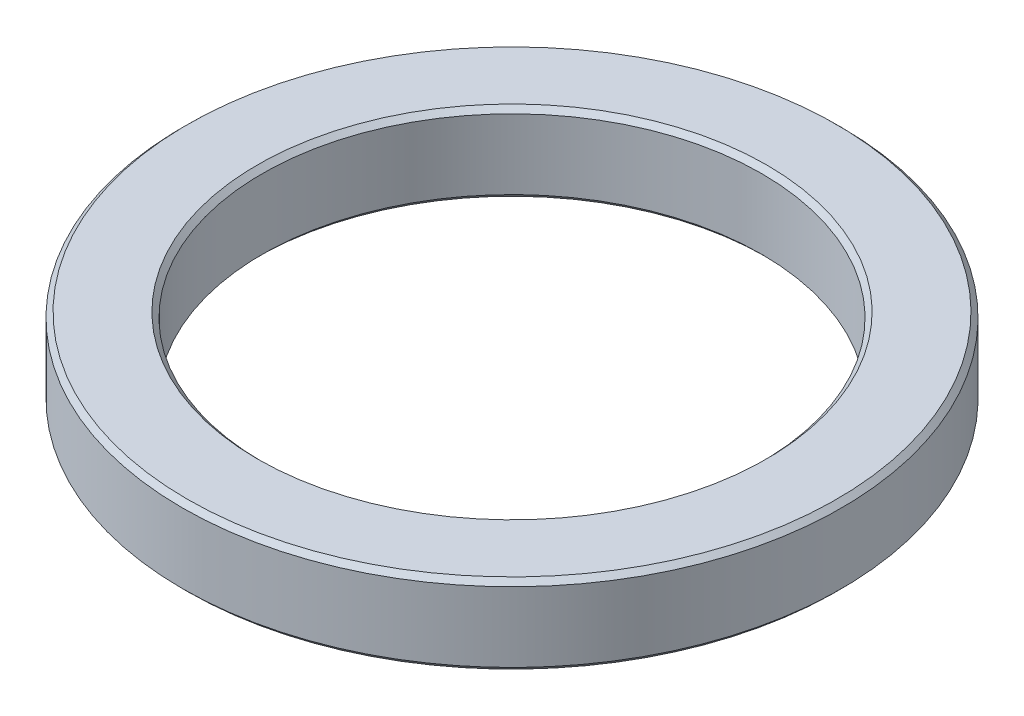
ISO-10303-21;
HEADER;
FILE_DESCRIPTION(('STEP AP214'),'2;1');
FILE_NAME('part.step','',(''),(''),'','','');
FILE_SCHEMA(('AUTOMOTIVE_DESIGN { 1 0 10303 214 1 1 1 1 }'));
ENDSEC;
DATA;
#1=APPLICATION_CONTEXT('core data for automotive mechanical design processes');
#2=APPLICATION_PROTOCOL_DEFINITION('international standard','automotive_design',2000,#1);
#3=PRODUCT_CONTEXT('',#1,'mechanical');
#4=PRODUCT('Part','Part','',(#3));
#5=PRODUCT_RELATED_PRODUCT_CATEGORY('part','',(#4));
#6=PRODUCT_DEFINITION_FORMATION('','',#4);
#7=PRODUCT_DEFINITION_CONTEXT('part definition',#1,'design');
#8=PRODUCT_DEFINITION('design','',#6,#7);
#9=PRODUCT_DEFINITION_SHAPE('','',#8);
#10=(LENGTH_UNIT() NAMED_UNIT(*) SI_UNIT(.MILLI.,.METRE.));
#11=(NAMED_UNIT(*) PLANE_ANGLE_UNIT() SI_UNIT($,.RADIAN.));
#12=(NAMED_UNIT(*) SI_UNIT($,.STERADIAN.) SOLID_ANGLE_UNIT());
#13=UNCERTAINTY_MEASURE_WITH_UNIT(LENGTH_MEASURE(1.E-05),#10,'distance_accuracy_value','');
#14=(GEOMETRIC_REPRESENTATION_CONTEXT(3) GLOBAL_UNCERTAINTY_ASSIGNED_CONTEXT((#13)) GLOBAL_UNIT_ASSIGNED_CONTEXT((#10,
#11,#12)) REPRESENTATION_CONTEXT('',''));
#15=CARTESIAN_POINT('',(0.,0.,0.));
#16=DIRECTION('',(0.,0.,1.));
#17=DIRECTION('',(1.,0.,0.));
#18=AXIS2_PLACEMENT_3D('',#15,#16,#17);
#19=CARTESIAN_POINT('',(0.,4.,0.));
#20=DIRECTION('',(0.,1.,0.));
#21=DIRECTION('',(0.,0.,1.));
#22=AXIS2_PLACEMENT_3D('',#19,#20,#21);
#23=PLANE('',#22);
#24=CARTESIAN_POINT('',(0.,4.,0.));
#25=DIRECTION('',(0.,1.,0.));
#26=DIRECTION('',(0.,0.,1.));
#27=AXIS2_PLACEMENT_3D('',#24,#25,#26);
#28=CIRCLE('',#27,25.5);
#29=CARTESIAN_POINT('',(0.,4.,25.5));
#30=VERTEX_POINT('',#29);
#31=EDGE_CURVE('E10',#30,#30,#28,.F.);
#32=ORIENTED_EDGE('',*,*,#31,.T.);
#33=EDGE_LOOP('',(#32));
#34=FACE_BOUND('',#33,.T.);
#35=CARTESIAN_POINT('',(0.,4.,0.));
#36=DIRECTION('',(0.,1.,0.));
#37=DIRECTION('',(0.,0.,1.));
#38=AXIS2_PLACEMENT_3D('',#35,#36,#37);
#39=CIRCLE('',#38,32.5);
#40=CARTESIAN_POINT('',(0.,4.,32.5));
#41=VERTEX_POINT('',#40);
#42=EDGE_CURVE('E43',#41,#41,#39,.T.);
#43=ORIENTED_EDGE('',*,*,#42,.T.);
#44=EDGE_LOOP('',(#43));
#45=FACE_BOUND('',#44,.T.);
#46=ADVANCED_FACE('F35',(#34,#45),#23,.T.);
#47=CARTESIAN_POINT('',(0.,-4.,0.));
#48=DIRECTION('',(0.,1.,0.));
#49=DIRECTION('',(0.,0.,1.));
#50=AXIS2_PLACEMENT_3D('',#47,#48,#49);
#51=PLANE('',#50);
#52=CARTESIAN_POINT('',(0.,-4.,0.));
#53=DIRECTION('',(0.,1.,0.));
#54=DIRECTION('',(0.,0.,1.));
#55=AXIS2_PLACEMENT_3D('',#52,#53,#54);
#56=CIRCLE('',#55,25.5);
#57=CARTESIAN_POINT('',(0.,-4.,25.5));
#58=VERTEX_POINT('',#57);
#59=EDGE_CURVE('E62',#58,#58,#56,.T.);
#60=ORIENTED_EDGE('',*,*,#59,.T.);
#61=EDGE_LOOP('',(#60));
#62=FACE_BOUND('',#61,.T.);
#63=CARTESIAN_POINT('',(0.,-4.,0.));
#64=DIRECTION('',(0.,1.,0.));
#65=DIRECTION('',(0.,0.,1.));
#66=AXIS2_PLACEMENT_3D('',#63,#64,#65);
#67=CIRCLE('',#66,32.5);
#68=CARTESIAN_POINT('',(0.,-4.,32.5));
#69=VERTEX_POINT('',#68);
#70=EDGE_CURVE('E65',#69,#69,#67,.F.);
#71=ORIENTED_EDGE('',*,*,#70,.T.);
#72=EDGE_LOOP('',(#71));
#73=FACE_BOUND('',#72,.T.);
#74=ADVANCED_FACE('F69',(#62,#73),#51,.F.);
#75=CARTESIAN_POINT('',(0.,4.,0.));
#76=DIRECTION('',(0.,-1.,0.));
#77=DIRECTION('',(0.,0.,-1.));
#78=AXIS2_PLACEMENT_3D('',#75,#76,#77);
#79=CYLINDRICAL_SURFACE('',#78,33.);
#80=CARTESIAN_POINT('',(0.,-3.5,0.));
#81=DIRECTION('',(0.,1.,0.));
#82=DIRECTION('',(0.,0.,1.));
#83=AXIS2_PLACEMENT_3D('',#80,#81,#82);
#84=CIRCLE('',#83,33.);
#85=CARTESIAN_POINT('',(0.,-3.5,33.));
#86=VERTEX_POINT('',#85);
#87=EDGE_CURVE('E47',#86,#86,#84,.T.);
#88=ORIENTED_EDGE('',*,*,#87,.T.);
#89=EDGE_LOOP('',(#88));
#90=FACE_BOUND('',#89,.T.);
#91=CARTESIAN_POINT('',(0.,3.5,0.));
#92=DIRECTION('',(0.,1.,0.));
#93=DIRECTION('',(0.,0.,1.));
#94=AXIS2_PLACEMENT_3D('',#91,#92,#93);
#95=CIRCLE('',#94,33.);
#96=CARTESIAN_POINT('',(0.,3.5,33.));
#97=VERTEX_POINT('',#96);
#98=EDGE_CURVE('E51',#97,#97,#95,.F.);
#99=ORIENTED_EDGE('',*,*,#98,.T.);
#100=EDGE_LOOP('',(#99));
#101=FACE_BOUND('',#100,.T.);
#102=ADVANCED_FACE('F79',(#90,#101),#79,.T.);
#103=CARTESIAN_POINT('',(0.,4.,0.));
#104=DIRECTION('',(0.,-1.,0.));
#105=DIRECTION('',(0.,0.,-1.));
#106=AXIS2_PLACEMENT_3D('',#103,#104,#105);
#107=CYLINDRICAL_SURFACE('',#106,25.);
#108=CARTESIAN_POINT('',(0.,-3.49999999999999,0.));
#109=DIRECTION('',(0.,1.,0.));
#110=DIRECTION('',(0.,0.,1.));
#111=AXIS2_PLACEMENT_3D('',#108,#109,#110);
#112=CIRCLE('',#111,25.);
#113=CARTESIAN_POINT('',(0.,-3.49999999999999,25.));
#114=VERTEX_POINT('',#113);
#115=EDGE_CURVE('E56',#114,#114,#112,.F.);
#116=ORIENTED_EDGE('',*,*,#115,.T.);
#117=EDGE_LOOP('',(#116));
#118=FACE_BOUND('',#117,.T.);
#119=CARTESIAN_POINT('',(0.,3.5,0.));
#120=DIRECTION('',(0.,1.,0.));
#121=DIRECTION('',(0.,0.,1.));
#122=AXIS2_PLACEMENT_3D('',#119,#120,#121);
#123=CIRCLE('',#122,25.);
#124=CARTESIAN_POINT('',(0.,3.5,25.));
#125=VERTEX_POINT('',#124);
#126=EDGE_CURVE('E59',#125,#125,#123,.T.);
#127=ORIENTED_EDGE('',*,*,#126,.T.);
#128=EDGE_LOOP('',(#127));
#129=FACE_BOUND('',#128,.T.);
#130=ADVANCED_FACE('F82',(#118,#129),#107,.F.);
#131=CARTESIAN_POINT('',(0.,-4.,0.));
#132=DIRECTION('',(0.,-1.,0.));
#133=DIRECTION('',(0.,0.,-1.));
#134=AXIS2_PLACEMENT_3D('',#131,#132,#133);
#135=CONICAL_SURFACE('',#134,25.5,0.785398163397438);
#136=ORIENTED_EDGE('',*,*,#115,.F.);
#137=EDGE_LOOP('',(#136));
#138=FACE_BOUND('',#137,.T.);
#139=ORIENTED_EDGE('',*,*,#59,.F.);
#140=EDGE_LOOP('',(#139));
#141=FACE_BOUND('',#140,.T.);
#142=ADVANCED_FACE('F75',(#138,#141),#135,.F.);
#143=CARTESIAN_POINT('',(0.,-3.5,0.));
#144=DIRECTION('',(0.,1.,0.));
#145=DIRECTION('',(0.,0.,1.));
#146=AXIS2_PLACEMENT_3D('',#143,#144,#145);
#147=CONICAL_SURFACE('',#146,33.,0.785398163397455);
#148=ORIENTED_EDGE('',*,*,#70,.F.);
#149=EDGE_LOOP('',(#148));
#150=FACE_BOUND('',#149,.T.);
#151=ORIENTED_EDGE('',*,*,#87,.F.);
#152=EDGE_LOOP('',(#151));
#153=FACE_BOUND('',#152,.T.);
#154=ADVANCED_FACE('F71',(#150,#153),#147,.T.);
#155=CARTESIAN_POINT('',(0.,3.5,0.));
#156=DIRECTION('',(0.,1.,0.));
#157=DIRECTION('',(0.,0.,1.));
#158=AXIS2_PLACEMENT_3D('',#155,#156,#157);
#159=CONICAL_SURFACE('',#158,25.,0.785398163397445);
#160=ORIENTED_EDGE('',*,*,#31,.F.);
#161=EDGE_LOOP('',(#160));
#162=FACE_BOUND('',#161,.T.);
#163=ORIENTED_EDGE('',*,*,#126,.F.);
#164=EDGE_LOOP('',(#163));
#165=FACE_BOUND('',#164,.T.);
#166=ADVANCED_FACE('F74',(#162,#165),#159,.F.);
#167=CARTESIAN_POINT('',(0.,4.,0.));
#168=DIRECTION('',(0.,-1.,0.));
#169=DIRECTION('',(0.,0.,-1.));
#170=AXIS2_PLACEMENT_3D('',#167,#168,#169);
#171=CONICAL_SURFACE('',#170,32.5,0.785398163397448);
#172=ORIENTED_EDGE('',*,*,#98,.F.);
#173=EDGE_LOOP('',(#172));
#174=FACE_BOUND('',#173,.T.);
#175=ORIENTED_EDGE('',*,*,#42,.F.);
#176=EDGE_LOOP('',(#175));
#177=FACE_BOUND('',#176,.T.);
#178=ADVANCED_FACE('F38',(#174,#177),#171,.T.);
#179=CLOSED_SHELL('',(#46,#74,#102,#130,#142,#154,#166,#178));
#180=MANIFOLD_SOLID_BREP('B2',#179);
#181=ADVANCED_BREP_SHAPE_REPRESENTATION('',(#18,#180),#14);
#182=SHAPE_DEFINITION_REPRESENTATION(#9,#181);
ENDSEC;
END-ISO-10303-21;
